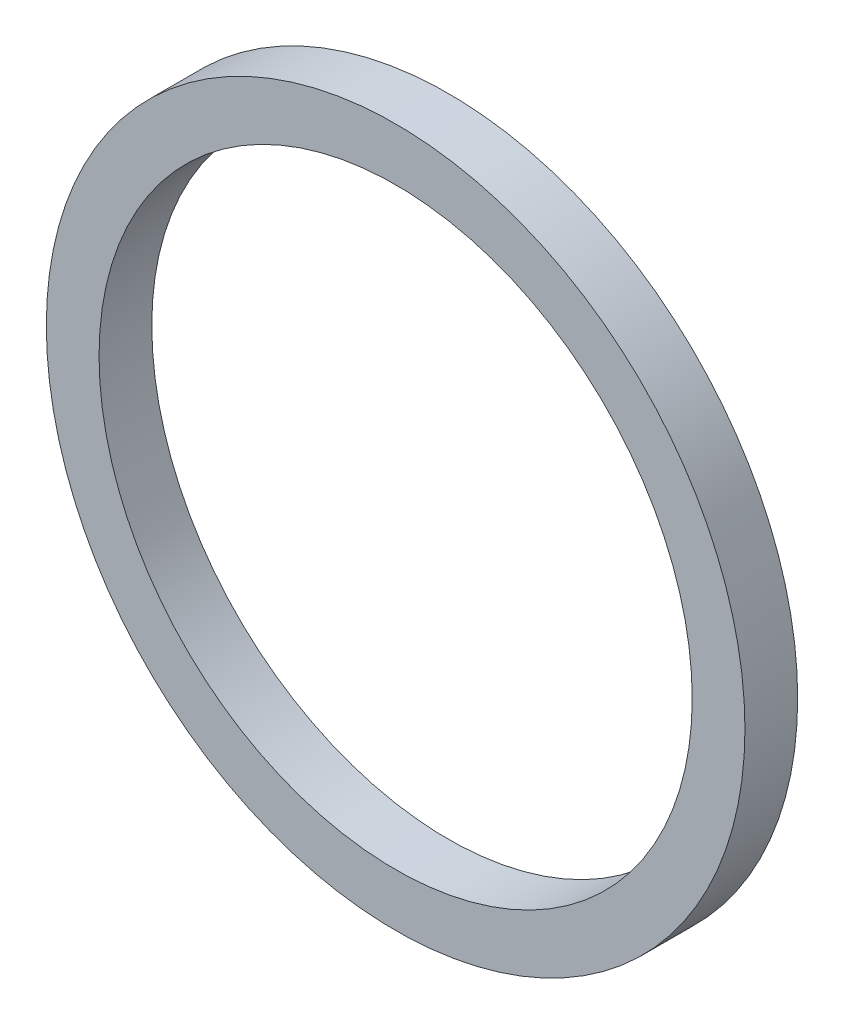
ISO-10303-21;
HEADER;
FILE_DESCRIPTION(('STEP AP214'),'2;1');
FILE_NAME('part.step','',(''),(''),'','','');
FILE_SCHEMA(('AUTOMOTIVE_DESIGN { 1 0 10303 214 1 1 1 1 }'));
ENDSEC;
DATA;
#1=APPLICATION_CONTEXT('core data for automotive mechanical design processes');
#2=APPLICATION_PROTOCOL_DEFINITION('international standard','automotive_design',2000,#1);
#3=PRODUCT_CONTEXT('',#1,'mechanical');
#4=PRODUCT('Part','Part','',(#3));
#5=PRODUCT_RELATED_PRODUCT_CATEGORY('part','',(#4));
#6=PRODUCT_DEFINITION_FORMATION('','',#4);
#7=PRODUCT_DEFINITION_CONTEXT('part definition',#1,'design');
#8=PRODUCT_DEFINITION('design','',#6,#7);
#9=PRODUCT_DEFINITION_SHAPE('','',#8);
#10=(LENGTH_UNIT() NAMED_UNIT(*) SI_UNIT(.MILLI.,.METRE.));
#11=(NAMED_UNIT(*) PLANE_ANGLE_UNIT() SI_UNIT($,.RADIAN.));
#12=(NAMED_UNIT(*) SI_UNIT($,.STERADIAN.) SOLID_ANGLE_UNIT());
#13=UNCERTAINTY_MEASURE_WITH_UNIT(LENGTH_MEASURE(1.E-05),#10,'distance_accuracy_value','');
#14=(GEOMETRIC_REPRESENTATION_CONTEXT(3) GLOBAL_UNCERTAINTY_ASSIGNED_CONTEXT((#13)) GLOBAL_UNIT_ASSIGNED_CONTEXT((#10,
#11,#12)) REPRESENTATION_CONTEXT('',''));
#15=CARTESIAN_POINT('',(0.,0.,0.));
#16=DIRECTION('',(0.,0.,1.));
#17=DIRECTION('',(1.,0.,0.));
#18=AXIS2_PLACEMENT_3D('',#15,#16,#17);
#19=CARTESIAN_POINT('',(0.,0.,8.));
#20=DIRECTION('',(0.,0.,-1.));
#21=DIRECTION('',(-1.,0.,0.));
#22=AXIS2_PLACEMENT_3D('',#19,#20,#21);
#23=CYLINDRICAL_SURFACE('',#22,53.);
#24=CARTESIAN_POINT('',(0.,0.,8.));
#25=DIRECTION('',(0.,0.,1.));
#26=DIRECTION('',(1.,0.,0.));
#27=AXIS2_PLACEMENT_3D('',#24,#25,#26);
#28=CIRCLE('',#27,53.);
#29=CARTESIAN_POINT('',(53.,0.,8.));
#30=VERTEX_POINT('',#29);
#31=EDGE_CURVE('E44',#30,#30,#28,.T.);
#32=ORIENTED_EDGE('',*,*,#31,.F.);
#33=EDGE_LOOP('',(#32));
#34=FACE_BOUND('',#33,.T.);
#35=CARTESIAN_POINT('',(0.,0.,0.));
#36=DIRECTION('',(0.,0.,1.));
#37=DIRECTION('',(1.,0.,0.));
#38=AXIS2_PLACEMENT_3D('',#35,#36,#37);
#39=CIRCLE('',#38,53.);
#40=CARTESIAN_POINT('',(53.,0.,0.));
#41=VERTEX_POINT('',#40);
#42=EDGE_CURVE('E50',#41,#41,#39,.T.);
#43=ORIENTED_EDGE('',*,*,#42,.T.);
#44=EDGE_LOOP('',(#43));
#45=FACE_BOUND('',#44,.T.);
#46=ADVANCED_FACE('F37',(#34,#45),#23,.T.);
#47=CARTESIAN_POINT('',(0.,0.,8.));
#48=DIRECTION('',(0.,0.,-1.));
#49=DIRECTION('',(-1.,0.,0.));
#50=AXIS2_PLACEMENT_3D('',#47,#48,#49);
#51=CYLINDRICAL_SURFACE('',#50,45.);
#52=CARTESIAN_POINT('',(0.,0.,8.));
#53=DIRECTION('',(0.,0.,1.));
#54=DIRECTION('',(1.,0.,0.));
#55=AXIS2_PLACEMENT_3D('',#52,#53,#54);
#56=CIRCLE('',#55,45.);
#57=CARTESIAN_POINT('',(45.,0.,8.));
#58=VERTEX_POINT('',#57);
#59=EDGE_CURVE('E10',#58,#58,#56,.T.);
#60=ORIENTED_EDGE('',*,*,#59,.T.);
#61=EDGE_LOOP('',(#60));
#62=FACE_BOUND('',#61,.T.);
#63=CARTESIAN_POINT('',(0.,0.,0.));
#64=DIRECTION('',(0.,0.,1.));
#65=DIRECTION('',(1.,0.,0.));
#66=AXIS2_PLACEMENT_3D('',#63,#64,#65);
#67=CIRCLE('',#66,45.);
#68=CARTESIAN_POINT('',(45.,0.,0.));
#69=VERTEX_POINT('',#68);
#70=EDGE_CURVE('E40',#69,#69,#67,.T.);
#71=ORIENTED_EDGE('',*,*,#70,.F.);
#72=EDGE_LOOP('',(#71));
#73=FACE_BOUND('',#72,.T.);
#74=ADVANCED_FACE('F59',(#62,#73),#51,.F.);
#75=CARTESIAN_POINT('',(0.,0.,8.));
#76=DIRECTION('',(0.,0.,1.));
#77=DIRECTION('',(1.,0.,0.));
#78=AXIS2_PLACEMENT_3D('',#75,#76,#77);
#79=PLANE('',#78);
#80=ORIENTED_EDGE('',*,*,#31,.T.);
#81=EDGE_LOOP('',(#80));
#82=FACE_BOUND('',#81,.T.);
#83=ORIENTED_EDGE('',*,*,#59,.F.);
#84=EDGE_LOOP('',(#83));
#85=FACE_BOUND('',#84,.T.);
#86=ADVANCED_FACE('F61',(#82,#85),#79,.T.);
#87=CARTESIAN_POINT('',(0.,0.,0.));
#88=DIRECTION('',(0.,0.,1.));
#89=DIRECTION('',(1.,0.,0.));
#90=AXIS2_PLACEMENT_3D('',#87,#88,#89);
#91=PLANE('',#90);
#92=ORIENTED_EDGE('',*,*,#42,.F.);
#93=EDGE_LOOP('',(#92));
#94=FACE_BOUND('',#93,.T.);
#95=ORIENTED_EDGE('',*,*,#70,.T.);
#96=EDGE_LOOP('',(#95));
#97=FACE_BOUND('',#96,.T.);
#98=ADVANCED_FACE('F57',(#94,#97),#91,.F.);
#99=CLOSED_SHELL('',(#46,#74,#86,#98));
#100=MANIFOLD_SOLID_BREP('B2',#99);
#101=ADVANCED_BREP_SHAPE_REPRESENTATION('',(#18,#100),#14);
#102=SHAPE_DEFINITION_REPRESENTATION(#9,#101);
ENDSEC;
END-ISO-10303-21;
